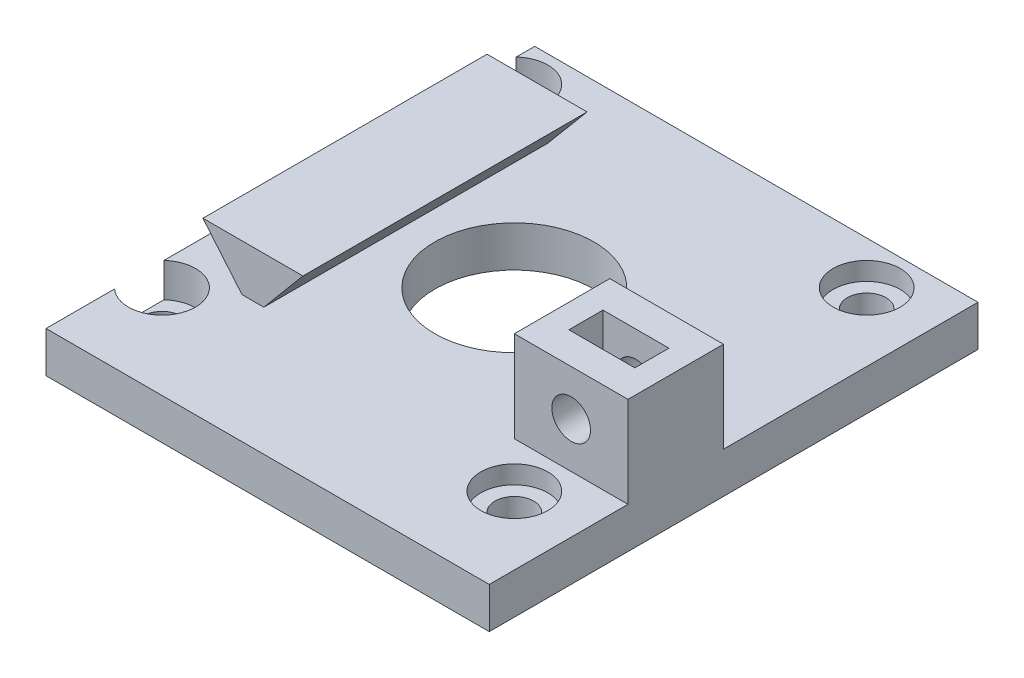
ISO-10303-21;
HEADER;
FILE_DESCRIPTION(('STEP AP214'),'2;1');
FILE_NAME('part.step','',(''),(''),'','','');
FILE_SCHEMA(('AUTOMOTIVE_DESIGN { 1 0 10303 214 1 1 1 1 }'));
ENDSEC;
DATA;
#1=APPLICATION_CONTEXT('core data for automotive mechanical design processes');
#2=APPLICATION_PROTOCOL_DEFINITION('international standard','automotive_design',2000,#1);
#3=PRODUCT_CONTEXT('',#1,'mechanical');
#4=PRODUCT('Part','Part','',(#3));
#5=PRODUCT_RELATED_PRODUCT_CATEGORY('part','',(#4));
#6=PRODUCT_DEFINITION_FORMATION('','',#4);
#7=PRODUCT_DEFINITION_CONTEXT('part definition',#1,'design');
#8=PRODUCT_DEFINITION('design','',#6,#7);
#9=PRODUCT_DEFINITION_SHAPE('','',#8);
#10=(LENGTH_UNIT() NAMED_UNIT(*) SI_UNIT(.MILLI.,.METRE.));
#11=(NAMED_UNIT(*) PLANE_ANGLE_UNIT() SI_UNIT($,.RADIAN.));
#12=(NAMED_UNIT(*) SI_UNIT($,.STERADIAN.) SOLID_ANGLE_UNIT());
#13=UNCERTAINTY_MEASURE_WITH_UNIT(LENGTH_MEASURE(1.E-05),#10,'distance_accuracy_value','');
#14=(GEOMETRIC_REPRESENTATION_CONTEXT(3) GLOBAL_UNCERTAINTY_ASSIGNED_CONTEXT((#13)) GLOBAL_UNIT_ASSIGNED_CONTEXT((#10,
#11,#12)) REPRESENTATION_CONTEXT('',''));
#15=CARTESIAN_POINT('',(0.,0.,0.));
#16=DIRECTION('',(0.,0.,1.));
#17=DIRECTION('',(1.,0.,0.));
#18=AXIS2_PLACEMENT_3D('',#15,#16,#17);
#19=CARTESIAN_POINT('',(-15.5,3.6,-15.5));
#20=DIRECTION('',(0.,-1.,0.));
#21=DIRECTION('',(0.,0.,-1.));
#22=AXIS2_PLACEMENT_3D('',#19,#20,#21);
#23=CYLINDRICAL_SURFACE('',#22,1.7);
#24=CARTESIAN_POINT('',(-15.5,0.,-15.5));
#25=DIRECTION('',(0.,1.,0.));
#26=DIRECTION('',(0.,0.,1.));
#27=AXIS2_PLACEMENT_3D('',#24,#25,#26);
#28=CIRCLE('',#27,1.7);
#29=CARTESIAN_POINT('',(-15.5,0.,-13.8));
#30=VERTEX_POINT('',#29);
#31=EDGE_CURVE('E379',#30,#30,#28,.T.);
#32=ORIENTED_EDGE('',*,*,#31,.F.);
#33=EDGE_LOOP('',(#32));
#34=FACE_BOUND('',#33,.T.);
#35=CARTESIAN_POINT('',(-15.5,0.6,-15.5));
#36=DIRECTION('',(0.,1.,0.));
#37=DIRECTION('',(0.,0.,1.));
#38=AXIS2_PLACEMENT_3D('',#35,#36,#37);
#39=CIRCLE('',#38,1.7);
#40=CARTESIAN_POINT('',(-15.5,0.6,-13.8));
#41=VERTEX_POINT('',#40);
#42=EDGE_CURVE('E210',#41,#41,#39,.T.);
#43=ORIENTED_EDGE('',*,*,#42,.T.);
#44=EDGE_LOOP('',(#43));
#45=FACE_BOUND('',#44,.T.);
#46=ADVANCED_FACE('F42',(#34,#45),#23,.F.);
#47=CARTESIAN_POINT('',(-15.5,3.6,15.5));
#48=DIRECTION('',(0.,-1.,0.));
#49=DIRECTION('',(0.,0.,-1.));
#50=AXIS2_PLACEMENT_3D('',#47,#48,#49);
#51=CYLINDRICAL_SURFACE('',#50,1.7);
#52=CARTESIAN_POINT('',(-15.5,0.,15.5));
#53=DIRECTION('',(0.,1.,0.));
#54=DIRECTION('',(0.,0.,1.));
#55=AXIS2_PLACEMENT_3D('',#52,#53,#54);
#56=CIRCLE('',#55,1.7);
#57=CARTESIAN_POINT('',(-15.5,0.,17.2));
#58=VERTEX_POINT('',#57);
#59=EDGE_CURVE('E370',#58,#58,#56,.T.);
#60=ORIENTED_EDGE('',*,*,#59,.F.);
#61=EDGE_LOOP('',(#60));
#62=FACE_BOUND('',#61,.T.);
#63=CARTESIAN_POINT('',(-15.5,0.6,15.5));
#64=DIRECTION('',(0.,1.,0.));
#65=DIRECTION('',(0.,0.,1.));
#66=AXIS2_PLACEMENT_3D('',#63,#64,#65);
#67=CIRCLE('',#66,1.7);
#68=CARTESIAN_POINT('',(-15.5,0.6,17.2));
#69=VERTEX_POINT('',#68);
#70=EDGE_CURVE('E215',#69,#69,#67,.T.);
#71=ORIENTED_EDGE('',*,*,#70,.T.);
#72=EDGE_LOOP('',(#71));
#73=FACE_BOUND('',#72,.T.);
#74=ADVANCED_FACE('F507',(#62,#73),#51,.F.);
#75=CARTESIAN_POINT('',(16.5,7.6,0.5));
#76=DIRECTION('',(0.,0.,1.));
#77=DIRECTION('',(1.,0.,0.));
#78=AXIS2_PLACEMENT_3D('',#75,#76,#77);
#79=CYLINDRICAL_SURFACE('',#78,1.7);
#80=CARTESIAN_POINT('',(16.5,7.6,3.1));
#81=DIRECTION('',(0.,0.,1.));
#82=DIRECTION('',(1.,0.,0.));
#83=AXIS2_PLACEMENT_3D('',#80,#81,#82);
#84=CIRCLE('',#83,1.7);
#85=CARTESIAN_POINT('',(18.2,7.6,3.1));
#86=VERTEX_POINT('',#85);
#87=EDGE_CURVE('E302',#86,#86,#84,.T.);
#88=ORIENTED_EDGE('',*,*,#87,.F.);
#89=EDGE_LOOP('',(#88));
#90=FACE_BOUND('',#89,.T.);
#91=CARTESIAN_POINT('',(16.5,7.6,5.8));
#92=DIRECTION('',(0.,0.,1.));
#93=DIRECTION('',(1.,0.,0.));
#94=AXIS2_PLACEMENT_3D('',#91,#92,#93);
#95=CIRCLE('',#94,1.7);
#96=CARTESIAN_POINT('',(18.2,7.6,5.8));
#97=VERTEX_POINT('',#96);
#98=EDGE_CURVE('E289',#97,#97,#95,.F.);
#99=ORIENTED_EDGE('',*,*,#98,.F.);
#100=EDGE_LOOP('',(#99));
#101=FACE_BOUND('',#100,.T.);
#102=ADVANCED_FACE('F513',(#90,#101),#79,.F.);
#103=CARTESIAN_POINT('',(15.5,3.6,-15.5));
#104=DIRECTION('',(0.,-1.,0.));
#105=DIRECTION('',(0.,0.,-1.));
#106=AXIS2_PLACEMENT_3D('',#103,#104,#105);
#107=CYLINDRICAL_SURFACE('',#106,1.7);
#108=CARTESIAN_POINT('',(15.5,0.,-15.5));
#109=DIRECTION('',(0.,1.,0.));
#110=DIRECTION('',(0.,0.,1.));
#111=AXIS2_PLACEMENT_3D('',#108,#109,#110);
#112=CIRCLE('',#111,1.7);
#113=CARTESIAN_POINT('',(15.5,0.,-13.8));
#114=VERTEX_POINT('',#113);
#115=EDGE_CURVE('E375',#114,#114,#112,.T.);
#116=ORIENTED_EDGE('',*,*,#115,.F.);
#117=EDGE_LOOP('',(#116));
#118=FACE_BOUND('',#117,.T.);
#119=CARTESIAN_POINT('',(15.5,2.,-15.5));
#120=DIRECTION('',(0.,1.,0.));
#121=DIRECTION('',(0.,0.,1.));
#122=AXIS2_PLACEMENT_3D('',#119,#120,#121);
#123=CIRCLE('',#122,1.7);
#124=CARTESIAN_POINT('',(15.5,2.,-13.8));
#125=VERTEX_POINT('',#124);
#126=EDGE_CURVE('E371',#125,#125,#123,.T.);
#127=ORIENTED_EDGE('',*,*,#126,.T.);
#128=EDGE_LOOP('',(#127));
#129=FACE_BOUND('',#128,.T.);
#130=ADVANCED_FACE('F520',(#118,#129),#107,.F.);
#131=CARTESIAN_POINT('',(15.5,3.6,15.5));
#132=DIRECTION('',(0.,-1.,0.));
#133=DIRECTION('',(0.,0.,-1.));
#134=AXIS2_PLACEMENT_3D('',#131,#132,#133);
#135=CYLINDRICAL_SURFACE('',#134,1.7);
#136=CARTESIAN_POINT('',(15.5,0.,15.5));
#137=DIRECTION('',(0.,1.,0.));
#138=DIRECTION('',(0.,0.,1.));
#139=AXIS2_PLACEMENT_3D('',#136,#137,#138);
#140=CIRCLE('',#139,1.7);
#141=CARTESIAN_POINT('',(15.5,0.,17.2));
#142=VERTEX_POINT('',#141);
#143=EDGE_CURVE('E366',#142,#142,#140,.T.);
#144=ORIENTED_EDGE('',*,*,#143,.F.);
#145=EDGE_LOOP('',(#144));
#146=FACE_BOUND('',#145,.T.);
#147=CARTESIAN_POINT('',(15.5,2.,15.5));
#148=DIRECTION('',(0.,1.,0.));
#149=DIRECTION('',(0.,0.,1.));
#150=AXIS2_PLACEMENT_3D('',#147,#148,#149);
#151=CIRCLE('',#150,1.7);
#152=CARTESIAN_POINT('',(15.5,2.,17.2));
#153=VERTEX_POINT('',#152);
#154=EDGE_CURVE('E365',#153,#153,#151,.T.);
#155=ORIENTED_EDGE('',*,*,#154,.T.);
#156=EDGE_LOOP('',(#155));
#157=FACE_BOUND('',#156,.T.);
#158=ADVANCED_FACE('F530',(#146,#157),#135,.F.);
#159=CARTESIAN_POINT('',(0.,3.6,0.));
#160=DIRECTION('',(0.,1.,0.));
#161=DIRECTION('',(0.,0.,1.));
#162=AXIS2_PLACEMENT_3D('',#159,#160,#161);
#163=PLANE('',#162);
#164=DIRECTION('',(-1.,0.,0.));
#165=VECTOR('',#164,1.);
#166=CARTESIAN_POINT('',(0.,3.6,-12.5));
#167=LINE('',#166,#165);
#168=CARTESIAN_POINT('',(-9.54030848782689,3.6,-12.5));
#169=VERTEX_POINT('',#168);
#170=CARTESIAN_POINT('',(-11.4596915121731,3.6,-12.5));
#171=VERTEX_POINT('',#170);
#172=EDGE_CURVE('E11',#169,#171,#167,.T.);
#173=ORIENTED_EDGE('',*,*,#172,.F.);
#174=DIRECTION('',(0.,0.,-1.));
#175=VECTOR('',#174,1.);
#176=CARTESIAN_POINT('',(-9.54030848782689,3.6,0.));
#177=LINE('',#176,#175);
#178=CARTESIAN_POINT('',(-9.54030848782689,3.6,12.5));
#179=VERTEX_POINT('',#178);
#180=EDGE_CURVE('E51',#179,#169,#177,.T.);
#181=ORIENTED_EDGE('',*,*,#180,.F.);
#182=DIRECTION('',(-1.,0.,0.));
#183=VECTOR('',#182,1.);
#184=CARTESIAN_POINT('',(0.,3.6,12.5));
#185=LINE('',#184,#183);
#186=CARTESIAN_POINT('',(-11.4596915121731,3.6,12.5));
#187=VERTEX_POINT('',#186);
#188=EDGE_CURVE('E467',#179,#187,#185,.T.);
#189=ORIENTED_EDGE('',*,*,#188,.T.);
#190=DIRECTION('',(0.,0.,1.));
#191=VECTOR('',#190,1.);
#192=CARTESIAN_POINT('',(-11.4596915121731,3.6,0.));
#193=LINE('',#192,#191);
#194=EDGE_CURVE('E471',#171,#187,#193,.T.);
#195=ORIENTED_EDGE('',*,*,#194,.F.);
#196=EDGE_LOOP('',(#173,#181,#189,#195));
#197=FACE_BOUND('',#196,.T.);
#198=DIRECTION('',(-1.,0.,0.));
#199=VECTOR('',#198,1.);
#200=CARTESIAN_POINT('',(21.5,3.6,3.1));
#201=LINE('',#200,#199);
#202=CARTESIAN_POINT('',(21.5,3.6,3.1));
#203=VERTEX_POINT('',#202);
#204=CARTESIAN_POINT('',(11.5,3.6,3.1));
#205=VERTEX_POINT('',#204);
#206=EDGE_CURVE('E308',#203,#205,#201,.T.);
#207=ORIENTED_EDGE('',*,*,#206,.F.);
#208=DIRECTION('',(0.,0.,-1.));
#209=VECTOR('',#208,1.);
#210=CARTESIAN_POINT('',(21.5,3.6,23.7051282051282));
#211=LINE('',#210,#209);
#212=CARTESIAN_POINT('',(21.5,3.6,-19.2948717948718));
#213=VERTEX_POINT('',#212);
#214=EDGE_CURVE('E401',#203,#213,#211,.T.);
#215=ORIENTED_EDGE('',*,*,#214,.T.);
#216=DIRECTION('',(-1.,0.,0.));
#217=VECTOR('',#216,1.);
#218=CARTESIAN_POINT('',(21.5,3.6,-19.2948717948718));
#219=LINE('',#218,#217);
#220=CARTESIAN_POINT('',(-17.5,3.6,-19.2948717948718));
#221=VERTEX_POINT('',#220);
#222=EDGE_CURVE('E405',#213,#221,#219,.T.);
#223=ORIENTED_EDGE('',*,*,#222,.T.);
#224=DIRECTION('',(0.,0.,1.));
#225=VECTOR('',#224,1.);
#226=CARTESIAN_POINT('',(-17.5,3.6,23.7051282051282));
#227=LINE('',#226,#225);
#228=CARTESIAN_POINT('',(-17.5,3.6,-17.6685248442201));
#229=VERTEX_POINT('',#228);
#230=EDGE_CURVE('E392',#221,#229,#227,.T.);
#231=ORIENTED_EDGE('',*,*,#230,.T.);
#232=CARTESIAN_POINT('',(-15.5,3.6,-15.5));
#233=DIRECTION('',(0.,1.,0.));
#234=DIRECTION('',(0.,0.,1.));
#235=AXIS2_PLACEMENT_3D('',#232,#233,#234);
#236=CIRCLE('',#235,2.95);
#237=CARTESIAN_POINT('',(-17.5,3.6,-13.3314751557799));
#238=VERTEX_POINT('',#237);
#239=EDGE_CURVE('E356',#238,#229,#236,.T.);
#240=ORIENTED_EDGE('',*,*,#239,.F.);
#241=CARTESIAN_POINT('',(-17.5,3.6,13.3314751557799));
#242=VERTEX_POINT('',#241);
#243=EDGE_CURVE('E397',#238,#242,#227,.T.);
#244=ORIENTED_EDGE('',*,*,#243,.T.);
#245=CARTESIAN_POINT('',(-15.5,3.6,15.5));
#246=DIRECTION('',(0.,1.,0.));
#247=DIRECTION('',(0.,0.,1.));
#248=AXIS2_PLACEMENT_3D('',#245,#246,#247);
#249=CIRCLE('',#248,2.95);
#250=CARTESIAN_POINT('',(-17.5,3.6,17.6685248442202));
#251=VERTEX_POINT('',#250);
#252=EDGE_CURVE('E193',#251,#242,#249,.T.);
#253=ORIENTED_EDGE('',*,*,#252,.F.);
#254=CARTESIAN_POINT('',(-17.5,3.6,23.7051282051282));
#255=VERTEX_POINT('',#254);
#256=EDGE_CURVE('E398',#251,#255,#227,.T.);
#257=ORIENTED_EDGE('',*,*,#256,.T.);
#258=DIRECTION('',(1.,0.,0.));
#259=VECTOR('',#258,1.);
#260=CARTESIAN_POINT('',(21.5,3.6,23.7051282051282));
#261=LINE('',#260,#259);
#262=CARTESIAN_POINT('',(21.5,3.6,23.7051282051282));
#263=VERTEX_POINT('',#262);
#264=EDGE_CURVE('E396',#255,#263,#261,.T.);
#265=ORIENTED_EDGE('',*,*,#264,.T.);
#266=CARTESIAN_POINT('',(21.5,3.6,11.5));
#267=VERTEX_POINT('',#266);
#268=EDGE_CURVE('E402',#263,#267,#211,.T.);
#269=ORIENTED_EDGE('',*,*,#268,.T.);
#270=DIRECTION('',(1.,0.,0.));
#271=VECTOR('',#270,1.);
#272=CARTESIAN_POINT('',(21.5,3.6,11.5));
#273=LINE('',#272,#271);
#274=CARTESIAN_POINT('',(11.5,3.6,11.5));
#275=VERTEX_POINT('',#274);
#276=EDGE_CURVE('E322',#275,#267,#273,.T.);
#277=ORIENTED_EDGE('',*,*,#276,.F.);
#278=DIRECTION('',(0.,0.,1.));
#279=VECTOR('',#278,1.);
#280=CARTESIAN_POINT('',(11.5,3.6,11.5));
#281=LINE('',#280,#279);
#282=EDGE_CURVE('E318',#205,#275,#281,.T.);
#283=ORIENTED_EDGE('',*,*,#282,.F.);
#284=EDGE_LOOP('',(#207,#215,#223,#231,#240,#244,#253,#257,#265,#269,#277,#283));
#285=FACE_BOUND('',#284,.T.);
#286=CARTESIAN_POINT('',(15.5,3.6,-15.5));
#287=DIRECTION('',(0.,1.,0.));
#288=DIRECTION('',(0.,0.,1.));
#289=AXIS2_PLACEMENT_3D('',#286,#287,#288);
#290=CIRCLE('',#289,2.95);
#291=CARTESIAN_POINT('',(15.5,3.6,-12.55));
#292=VERTEX_POINT('',#291);
#293=EDGE_CURVE('E357',#292,#292,#290,.T.);
#294=ORIENTED_EDGE('',*,*,#293,.F.);
#295=EDGE_LOOP('',(#294));
#296=FACE_BOUND('',#295,.T.);
#297=CARTESIAN_POINT('',(15.5,3.6,15.5));
#298=DIRECTION('',(0.,1.,0.));
#299=DIRECTION('',(0.,0.,1.));
#300=AXIS2_PLACEMENT_3D('',#297,#298,#299);
#301=CIRCLE('',#300,2.95);
#302=CARTESIAN_POINT('',(15.5,3.6,18.45));
#303=VERTEX_POINT('',#302);
#304=EDGE_CURVE('E344',#303,#303,#301,.T.);
#305=ORIENTED_EDGE('',*,*,#304,.F.);
#306=EDGE_LOOP('',(#305));
#307=FACE_BOUND('',#306,.T.);
#308=CARTESIAN_POINT('',(0.,3.6,0.));
#309=DIRECTION('',(0.,1.,0.));
#310=DIRECTION('',(0.,0.,1.));
#311=AXIS2_PLACEMENT_3D('',#308,#309,#310);
#312=CIRCLE('',#311,7.);
#313=CARTESIAN_POINT('',(0.,3.6,7.));
#314=VERTEX_POINT('',#313);
#315=EDGE_CURVE('E384',#314,#314,#312,.T.);
#316=ORIENTED_EDGE('',*,*,#315,.F.);
#317=EDGE_LOOP('',(#316));
#318=FACE_BOUND('',#317,.T.);
#319=ADVANCED_FACE('F488',(#197,#285,#296,#307,#318),#163,.T.);
#320=CARTESIAN_POINT('',(0.,0.,0.));
#321=DIRECTION('',(0.,1.,0.));
#322=DIRECTION('',(0.,0.,1.));
#323=AXIS2_PLACEMENT_3D('',#320,#321,#322);
#324=PLANE('',#323);
#325=DIRECTION('',(0.,0.,1.));
#326=VECTOR('',#325,1.);
#327=CARTESIAN_POINT('',(-17.5,0.,23.7051282051282));
#328=LINE('',#327,#326);
#329=CARTESIAN_POINT('',(-17.5,0.,-19.2948717948718));
#330=VERTEX_POINT('',#329);
#331=CARTESIAN_POINT('',(-17.5,0.,23.7051282051282));
#332=VERTEX_POINT('',#331);
#333=EDGE_CURVE('E388',#330,#332,#328,.T.);
#334=ORIENTED_EDGE('',*,*,#333,.F.);
#335=DIRECTION('',(-1.,0.,0.));
#336=VECTOR('',#335,1.);
#337=CARTESIAN_POINT('',(21.5,0.,-19.2948717948718));
#338=LINE('',#337,#336);
#339=CARTESIAN_POINT('',(21.5,0.,-19.2948717948718));
#340=VERTEX_POINT('',#339);
#341=EDGE_CURVE('E418',#340,#330,#338,.T.);
#342=ORIENTED_EDGE('',*,*,#341,.F.);
#343=DIRECTION('',(0.,0.,-1.));
#344=VECTOR('',#343,1.);
#345=CARTESIAN_POINT('',(21.5,0.,23.7051282051282));
#346=LINE('',#345,#344);
#347=CARTESIAN_POINT('',(21.5,0.,23.7051282051282));
#348=VERTEX_POINT('',#347);
#349=EDGE_CURVE('E415',#348,#340,#346,.T.);
#350=ORIENTED_EDGE('',*,*,#349,.F.);
#351=DIRECTION('',(1.,0.,0.));
#352=VECTOR('',#351,1.);
#353=CARTESIAN_POINT('',(21.5,0.,23.7051282051282));
#354=LINE('',#353,#352);
#355=EDGE_CURVE('E412',#332,#348,#354,.T.);
#356=ORIENTED_EDGE('',*,*,#355,.F.);
#357=EDGE_LOOP('',(#334,#342,#350,#356));
#358=FACE_BOUND('',#357,.T.);
#359=CARTESIAN_POINT('',(0.,0.,0.));
#360=DIRECTION('',(0.,1.,0.));
#361=DIRECTION('',(0.,0.,1.));
#362=AXIS2_PLACEMENT_3D('',#359,#360,#361);
#363=CIRCLE('',#362,7.);
#364=CARTESIAN_POINT('',(0.,0.,7.));
#365=VERTEX_POINT('',#364);
#366=EDGE_CURVE('E383',#365,#365,#363,.T.);
#367=ORIENTED_EDGE('',*,*,#366,.T.);
#368=EDGE_LOOP('',(#367));
#369=FACE_BOUND('',#368,.T.);
#370=ORIENTED_EDGE('',*,*,#31,.T.);
#371=EDGE_LOOP('',(#370));
#372=FACE_BOUND('',#371,.T.);
#373=ORIENTED_EDGE('',*,*,#115,.T.);
#374=EDGE_LOOP('',(#373));
#375=FACE_BOUND('',#374,.T.);
#376=ORIENTED_EDGE('',*,*,#59,.T.);
#377=EDGE_LOOP('',(#376));
#378=FACE_BOUND('',#377,.T.);
#379=ORIENTED_EDGE('',*,*,#143,.T.);
#380=EDGE_LOOP('',(#379));
#381=FACE_BOUND('',#380,.T.);
#382=ADVANCED_FACE('F529',(#358,#369,#372,#375,#378,#381),#324,.F.);
#383=CARTESIAN_POINT('',(-17.5,3.6,23.7051282051282));
#384=DIRECTION('',(1.,0.,0.));
#385=DIRECTION('',(0.,0.,-1.));
#386=AXIS2_PLACEMENT_3D('',#383,#384,#385);
#387=PLANE('',#386);
#388=DIRECTION('',(0.,0.,1.));
#389=VECTOR('',#388,1.);
#390=CARTESIAN_POINT('',(-17.5,0.6,13.3314751557799));
#391=LINE('',#390,#389);
#392=CARTESIAN_POINT('',(-17.5,0.6,13.3314751557799));
#393=VERTEX_POINT('',#392);
#394=CARTESIAN_POINT('',(-17.5,0.6,17.6685248442202));
#395=VERTEX_POINT('',#394);
#396=EDGE_CURVE('E204',#393,#395,#391,.T.);
#397=ORIENTED_EDGE('',*,*,#396,.F.);
#398=DIRECTION('',(0.,1.,0.));
#399=VECTOR('',#398,1.);
#400=CARTESIAN_POINT('',(-17.5,2.,13.3314751557799));
#401=LINE('',#400,#399);
#402=EDGE_CURVE('E187',#393,#242,#401,.T.);
#403=ORIENTED_EDGE('',*,*,#402,.T.);
#404=ORIENTED_EDGE('',*,*,#243,.F.);
#405=DIRECTION('',(0.,1.,0.));
#406=VECTOR('',#405,1.);
#407=CARTESIAN_POINT('',(-17.5,2.,-13.3314751557799));
#408=LINE('',#407,#406);
#409=CARTESIAN_POINT('',(-17.5,0.6,-13.3314751557799));
#410=VERTEX_POINT('',#409);
#411=EDGE_CURVE('E436',#238,#410,#408,.F.);
#412=ORIENTED_EDGE('',*,*,#411,.T.);
#413=DIRECTION('',(0.,0.,1.));
#414=VECTOR('',#413,1.);
#415=CARTESIAN_POINT('',(-17.5,0.6,-17.6685248442201));
#416=LINE('',#415,#414);
#417=CARTESIAN_POINT('',(-17.5,0.6,-17.6685248442201));
#418=VERTEX_POINT('',#417);
#419=EDGE_CURVE('E206',#418,#410,#416,.T.);
#420=ORIENTED_EDGE('',*,*,#419,.F.);
#421=DIRECTION('',(0.,1.,0.));
#422=VECTOR('',#421,1.);
#423=CARTESIAN_POINT('',(-17.5,2.,-17.6685248442201));
#424=LINE('',#423,#422);
#425=EDGE_CURVE('E445',#418,#229,#424,.T.);
#426=ORIENTED_EDGE('',*,*,#425,.T.);
#427=ORIENTED_EDGE('',*,*,#230,.F.);
#428=DIRECTION('',(0.,-1.,0.));
#429=VECTOR('',#428,1.);
#430=CARTESIAN_POINT('',(-17.5,3.6,-19.2948717948718));
#431=LINE('',#430,#429);
#432=EDGE_CURVE('E408',#221,#330,#431,.T.);
#433=ORIENTED_EDGE('',*,*,#432,.T.);
#434=ORIENTED_EDGE('',*,*,#333,.T.);
#435=DIRECTION('',(0.,-1.,0.));
#436=VECTOR('',#435,1.);
#437=CARTESIAN_POINT('',(-17.5,3.6,23.7051282051282));
#438=LINE('',#437,#436);
#439=EDGE_CURVE('E432',#255,#332,#438,.T.);
#440=ORIENTED_EDGE('',*,*,#439,.F.);
#441=ORIENTED_EDGE('',*,*,#256,.F.);
#442=DIRECTION('',(0.,1.,0.));
#443=VECTOR('',#442,1.);
#444=CARTESIAN_POINT('',(-17.5,2.,17.6685248442202));
#445=LINE('',#444,#443);
#446=EDGE_CURVE('E200',#251,#395,#445,.F.);
#447=ORIENTED_EDGE('',*,*,#446,.T.);
#448=EDGE_LOOP('',(#397,#403,#404,#412,#420,#426,#427,#433,#434,#440,#441,#447));
#449=FACE_BOUND('',#448,.T.);
#450=ADVANCED_FACE('F44',(#449),#387,.F.);
#451=CARTESIAN_POINT('',(21.5,3.6,23.7051282051282));
#452=DIRECTION('',(0.,0.,-1.));
#453=DIRECTION('',(-1.,0.,0.));
#454=AXIS2_PLACEMENT_3D('',#451,#452,#453);
#455=PLANE('',#454);
#456=ORIENTED_EDGE('',*,*,#355,.T.);
#457=DIRECTION('',(0.,-1.,0.));
#458=VECTOR('',#457,1.);
#459=CARTESIAN_POINT('',(21.5,3.6,23.7051282051282));
#460=LINE('',#459,#458);
#461=EDGE_CURVE('E428',#263,#348,#460,.T.);
#462=ORIENTED_EDGE('',*,*,#461,.F.);
#463=ORIENTED_EDGE('',*,*,#264,.F.);
#464=ORIENTED_EDGE('',*,*,#439,.T.);
#465=EDGE_LOOP('',(#456,#462,#463,#464));
#466=FACE_BOUND('',#465,.T.);
#467=ADVANCED_FACE('F539',(#466),#455,.F.);
#468=CARTESIAN_POINT('',(21.5,3.6,23.7051282051282));
#469=DIRECTION('',(-1.,0.,0.));
#470=DIRECTION('',(0.,0.,1.));
#471=AXIS2_PLACEMENT_3D('',#468,#469,#470);
#472=PLANE('',#471);
#473=ORIENTED_EDGE('',*,*,#349,.T.);
#474=DIRECTION('',(0.,-1.,0.));
#475=VECTOR('',#474,1.);
#476=CARTESIAN_POINT('',(21.5,3.6,-19.2948717948718));
#477=LINE('',#476,#475);
#478=EDGE_CURVE('E424',#213,#340,#477,.T.);
#479=ORIENTED_EDGE('',*,*,#478,.F.);
#480=ORIENTED_EDGE('',*,*,#214,.F.);
#481=DIRECTION('',(0.,-1.,0.));
#482=VECTOR('',#481,1.);
#483=CARTESIAN_POINT('',(21.5,11.6,3.1));
#484=LINE('',#483,#482);
#485=CARTESIAN_POINT('',(21.5,11.6,3.1));
#486=VERTEX_POINT('',#485);
#487=EDGE_CURVE('E332',#486,#203,#484,.T.);
#488=ORIENTED_EDGE('',*,*,#487,.F.);
#489=DIRECTION('',(0.,0.,-1.));
#490=VECTOR('',#489,1.);
#491=CARTESIAN_POINT('',(21.5,11.6,11.5));
#492=LINE('',#491,#490);
#493=CARTESIAN_POINT('',(21.5,11.6,11.5));
#494=VERTEX_POINT('',#493);
#495=EDGE_CURVE('E311',#494,#486,#492,.T.);
#496=ORIENTED_EDGE('',*,*,#495,.F.);
#497=DIRECTION('',(0.,-1.,0.));
#498=VECTOR('',#497,1.);
#499=CARTESIAN_POINT('',(21.5,11.6,11.5));
#500=LINE('',#499,#498);
#501=EDGE_CURVE('E336',#494,#267,#500,.T.);
#502=ORIENTED_EDGE('',*,*,#501,.T.);
#503=ORIENTED_EDGE('',*,*,#268,.F.);
#504=ORIENTED_EDGE('',*,*,#461,.T.);
#505=EDGE_LOOP('',(#473,#479,#480,#488,#496,#502,#503,#504));
#506=FACE_BOUND('',#505,.T.);
#507=ADVANCED_FACE('F536',(#506),#472,.F.);
#508=CARTESIAN_POINT('',(21.5,3.6,-19.2948717948718));
#509=DIRECTION('',(0.,0.,1.));
#510=DIRECTION('',(1.,0.,0.));
#511=AXIS2_PLACEMENT_3D('',#508,#509,#510);
#512=PLANE('',#511);
#513=ORIENTED_EDGE('',*,*,#341,.T.);
#514=ORIENTED_EDGE('',*,*,#432,.F.);
#515=ORIENTED_EDGE('',*,*,#222,.F.);
#516=ORIENTED_EDGE('',*,*,#478,.T.);
#517=EDGE_LOOP('',(#513,#514,#515,#516));
#518=FACE_BOUND('',#517,.T.);
#519=ADVANCED_FACE('F525',(#518),#512,.F.);
#520=CARTESIAN_POINT('',(0.,3.6,0.));
#521=DIRECTION('',(0.,-1.,0.));
#522=DIRECTION('',(0.,0.,-1.));
#523=AXIS2_PLACEMENT_3D('',#520,#521,#522);
#524=CYLINDRICAL_SURFACE('',#523,7.);
#525=ORIENTED_EDGE('',*,*,#315,.T.);
#526=EDGE_LOOP('',(#525));
#527=FACE_BOUND('',#526,.T.);
#528=ORIENTED_EDGE('',*,*,#366,.F.);
#529=EDGE_LOOP('',(#528));
#530=FACE_BOUND('',#529,.T.);
#531=ADVANCED_FACE('F521',(#527,#530),#524,.F.);
#532=CARTESIAN_POINT('',(15.5,2.,15.5));
#533=DIRECTION('',(0.,1.,0.));
#534=DIRECTION('',(0.,0.,1.));
#535=AXIS2_PLACEMENT_3D('',#532,#533,#534);
#536=CYLINDRICAL_SURFACE('',#535,2.95);
#537=CARTESIAN_POINT('',(15.5,2.,15.5));
#538=DIRECTION('',(0.,1.,0.));
#539=DIRECTION('',(0.,0.,1.));
#540=AXIS2_PLACEMENT_3D('',#537,#538,#539);
#541=CIRCLE('',#540,2.95);
#542=CARTESIAN_POINT('',(15.5,2.,18.45));
#543=VERTEX_POINT('',#542);
#544=EDGE_CURVE('E345',#543,#543,#541,.T.);
#545=ORIENTED_EDGE('',*,*,#544,.F.);
#546=EDGE_LOOP('',(#545));
#547=FACE_BOUND('',#546,.T.);
#548=ORIENTED_EDGE('',*,*,#304,.T.);
#549=EDGE_LOOP('',(#548));
#550=FACE_BOUND('',#549,.T.);
#551=ADVANCED_FACE('F524',(#547,#550),#536,.F.);
#552=CARTESIAN_POINT('',(15.5,2.,15.5));
#553=DIRECTION('',(0.,1.,0.));
#554=DIRECTION('',(0.,0.,1.));
#555=AXIS2_PLACEMENT_3D('',#552,#553,#554);
#556=PLANE('',#555);
#557=ORIENTED_EDGE('',*,*,#154,.F.);
#558=EDGE_LOOP('',(#557));
#559=FACE_BOUND('',#558,.T.);
#560=ORIENTED_EDGE('',*,*,#544,.T.);
#561=EDGE_LOOP('',(#560));
#562=FACE_BOUND('',#561,.T.);
#563=ADVANCED_FACE('F659',(#559,#562),#556,.T.);
#564=CARTESIAN_POINT('',(-15.5,2.,15.5));
#565=DIRECTION('',(0.,1.,0.));
#566=DIRECTION('',(0.,0.,1.));
#567=AXIS2_PLACEMENT_3D('',#564,#565,#566);
#568=CYLINDRICAL_SURFACE('',#567,2.95);
#569=ORIENTED_EDGE('',*,*,#402,.F.);
#570=CARTESIAN_POINT('',(-15.5,0.6,15.5));
#571=DIRECTION('',(0.,1.,0.));
#572=DIRECTION('',(0.,0.,1.));
#573=AXIS2_PLACEMENT_3D('',#570,#571,#572);
#574=CIRCLE('',#573,2.95);
#575=EDGE_CURVE('E190',#395,#393,#574,.T.);
#576=ORIENTED_EDGE('',*,*,#575,.F.);
#577=ORIENTED_EDGE('',*,*,#446,.F.);
#578=ORIENTED_EDGE('',*,*,#252,.T.);
#579=EDGE_LOOP('',(#569,#576,#577,#578));
#580=FACE_BOUND('',#579,.T.);
#581=ADVANCED_FACE('F189',(#580),#568,.F.);
#582=CARTESIAN_POINT('',(15.5,2.,-15.5));
#583=DIRECTION('',(0.,1.,0.));
#584=DIRECTION('',(0.,0.,1.));
#585=AXIS2_PLACEMENT_3D('',#582,#583,#584);
#586=CYLINDRICAL_SURFACE('',#585,2.95);
#587=CARTESIAN_POINT('',(15.5,2.,-15.5));
#588=DIRECTION('',(0.,1.,0.));
#589=DIRECTION('',(0.,0.,1.));
#590=AXIS2_PLACEMENT_3D('',#587,#588,#589);
#591=CIRCLE('',#590,2.95);
#592=CARTESIAN_POINT('',(15.5,2.,-12.55));
#593=VERTEX_POINT('',#592);
#594=EDGE_CURVE('E352',#593,#593,#591,.T.);
#595=ORIENTED_EDGE('',*,*,#594,.F.);
#596=EDGE_LOOP('',(#595));
#597=FACE_BOUND('',#596,.T.);
#598=ORIENTED_EDGE('',*,*,#293,.T.);
#599=EDGE_LOOP('',(#598));
#600=FACE_BOUND('',#599,.T.);
#601=ADVANCED_FACE('F643',(#597,#600),#586,.F.);
#602=CARTESIAN_POINT('',(15.5,2.,-15.5));
#603=DIRECTION('',(0.,1.,0.));
#604=DIRECTION('',(0.,0.,1.));
#605=AXIS2_PLACEMENT_3D('',#602,#603,#604);
#606=PLANE('',#605);
#607=ORIENTED_EDGE('',*,*,#126,.F.);
#608=EDGE_LOOP('',(#607));
#609=FACE_BOUND('',#608,.T.);
#610=ORIENTED_EDGE('',*,*,#594,.T.);
#611=EDGE_LOOP('',(#610));
#612=FACE_BOUND('',#611,.T.);
#613=ADVANCED_FACE('F634',(#609,#612),#606,.T.);
#614=CARTESIAN_POINT('',(-15.5,2.,-15.5));
#615=DIRECTION('',(0.,1.,0.));
#616=DIRECTION('',(0.,0.,1.));
#617=AXIS2_PLACEMENT_3D('',#614,#615,#616);
#618=CYLINDRICAL_SURFACE('',#617,2.95);
#619=ORIENTED_EDGE('',*,*,#425,.F.);
#620=CARTESIAN_POINT('',(-15.5,0.6,-15.5));
#621=DIRECTION('',(0.,1.,0.));
#622=DIRECTION('',(0.,0.,1.));
#623=AXIS2_PLACEMENT_3D('',#620,#621,#622);
#624=CIRCLE('',#623,2.95);
#625=EDGE_CURVE('E218',#410,#418,#624,.T.);
#626=ORIENTED_EDGE('',*,*,#625,.F.);
#627=ORIENTED_EDGE('',*,*,#411,.F.);
#628=ORIENTED_EDGE('',*,*,#239,.T.);
#629=EDGE_LOOP('',(#619,#626,#627,#628));
#630=FACE_BOUND('',#629,.T.);
#631=ADVANCED_FACE('F630',(#630),#618,.F.);
#632=CARTESIAN_POINT('',(11.5,11.6,11.5));
#633=DIRECTION('',(1.,0.,0.));
#634=DIRECTION('',(0.,0.,-1.));
#635=AXIS2_PLACEMENT_3D('',#632,#633,#634);
#636=PLANE('',#635);
#637=ORIENTED_EDGE('',*,*,#282,.T.);
#638=DIRECTION('',(0.,-1.,0.));
#639=VECTOR('',#638,1.);
#640=CARTESIAN_POINT('',(11.5,11.6,11.5));
#641=LINE('',#640,#639);
#642=CARTESIAN_POINT('',(11.5,11.6,11.5));
#643=VERTEX_POINT('',#642);
#644=EDGE_CURVE('E340',#643,#275,#641,.T.);
#645=ORIENTED_EDGE('',*,*,#644,.F.);
#646=DIRECTION('',(0.,0.,1.));
#647=VECTOR('',#646,1.);
#648=CARTESIAN_POINT('',(11.5,11.6,11.5));
#649=LINE('',#648,#647);
#650=CARTESIAN_POINT('',(11.5,11.6,3.1));
#651=VERTEX_POINT('',#650);
#652=EDGE_CURVE('E303',#651,#643,#649,.T.);
#653=ORIENTED_EDGE('',*,*,#652,.F.);
#654=DIRECTION('',(0.,-1.,0.));
#655=VECTOR('',#654,1.);
#656=CARTESIAN_POINT('',(11.5,11.6,3.1));
#657=LINE('',#656,#655);
#658=EDGE_CURVE('E317',#651,#205,#657,.T.);
#659=ORIENTED_EDGE('',*,*,#658,.T.);
#660=EDGE_LOOP('',(#637,#645,#653,#659));
#661=FACE_BOUND('',#660,.T.);
#662=ADVANCED_FACE('F633',(#661),#636,.F.);
#663=CARTESIAN_POINT('',(21.5,11.6,11.5));
#664=DIRECTION('',(0.,0.,-1.));
#665=DIRECTION('',(-1.,0.,0.));
#666=AXIS2_PLACEMENT_3D('',#663,#664,#665);
#667=PLANE('',#666);
#668=CARTESIAN_POINT('',(16.5,7.6,11.5));
#669=DIRECTION('',(0.,0.,1.));
#670=DIRECTION('',(1.,0.,0.));
#671=AXIS2_PLACEMENT_3D('',#668,#669,#670);
#672=CIRCLE('',#671,1.7);
#673=CARTESIAN_POINT('',(18.2,7.6,11.5));
#674=VERTEX_POINT('',#673);
#675=EDGE_CURVE('E298',#674,#674,#672,.T.);
#676=ORIENTED_EDGE('',*,*,#675,.F.);
#677=EDGE_LOOP('',(#676));
#678=FACE_BOUND('',#677,.T.);
#679=ORIENTED_EDGE('',*,*,#276,.T.);
#680=ORIENTED_EDGE('',*,*,#501,.F.);
#681=DIRECTION('',(1.,0.,0.));
#682=VECTOR('',#681,1.);
#683=CARTESIAN_POINT('',(21.5,11.6,11.5));
#684=LINE('',#683,#682);
#685=EDGE_CURVE('E307',#643,#494,#684,.T.);
#686=ORIENTED_EDGE('',*,*,#685,.F.);
#687=ORIENTED_EDGE('',*,*,#644,.T.);
#688=EDGE_LOOP('',(#679,#680,#686,#687));
#689=FACE_BOUND('',#688,.T.);
#690=ADVANCED_FACE('F640',(#678,#689),#667,.F.);
#691=CARTESIAN_POINT('',(21.5,11.6,3.1));
#692=DIRECTION('',(0.,0.,1.));
#693=DIRECTION('',(1.,0.,0.));
#694=AXIS2_PLACEMENT_3D('',#691,#692,#693);
#695=PLANE('',#694);
#696=ORIENTED_EDGE('',*,*,#87,.T.);
#697=EDGE_LOOP('',(#696));
#698=FACE_BOUND('',#697,.T.);
#699=ORIENTED_EDGE('',*,*,#206,.T.);
#700=ORIENTED_EDGE('',*,*,#658,.F.);
#701=DIRECTION('',(-1.,0.,0.));
#702=VECTOR('',#701,1.);
#703=CARTESIAN_POINT('',(21.5,11.6,3.1));
#704=LINE('',#703,#702);
#705=EDGE_CURVE('E314',#486,#651,#704,.T.);
#706=ORIENTED_EDGE('',*,*,#705,.F.);
#707=ORIENTED_EDGE('',*,*,#487,.T.);
#708=EDGE_LOOP('',(#699,#700,#706,#707));
#709=FACE_BOUND('',#708,.T.);
#710=ADVANCED_FACE('F807',(#698,#709),#695,.F.);
#711=CARTESIAN_POINT('',(0.,11.6,0.));
#712=DIRECTION('',(0.,1.,0.));
#713=DIRECTION('',(0.,0.,1.));
#714=AXIS2_PLACEMENT_3D('',#711,#712,#713);
#715=PLANE('',#714);
#716=DIRECTION('',(1.,0.,0.));
#717=VECTOR('',#716,1.);
#718=CARTESIAN_POINT('',(0.,11.6,8.8));
#719=LINE('',#718,#717);
#720=CARTESIAN_POINT('',(13.5988148973221,11.6,8.8));
#721=VERTEX_POINT('',#720);
#722=CARTESIAN_POINT('',(19.4011851026779,11.6,8.8));
#723=VERTEX_POINT('',#722);
#724=EDGE_CURVE('E295',#721,#723,#719,.T.);
#725=ORIENTED_EDGE('',*,*,#724,.F.);
#726=DIRECTION('',(0.,0.,-1.));
#727=VECTOR('',#726,1.);
#728=CARTESIAN_POINT('',(13.5988148973221,11.6,0.));
#729=LINE('',#728,#727);
#730=CARTESIAN_POINT('',(13.5988148973221,11.6,5.8));
#731=VERTEX_POINT('',#730);
#732=EDGE_CURVE('E199',#721,#731,#729,.T.);
#733=ORIENTED_EDGE('',*,*,#732,.T.);
#734=DIRECTION('',(1.,0.,0.));
#735=VECTOR('',#734,1.);
#736=CARTESIAN_POINT('',(0.,11.6,5.8));
#737=LINE('',#736,#735);
#738=CARTESIAN_POINT('',(19.4011851026779,11.6,5.8));
#739=VERTEX_POINT('',#738);
#740=EDGE_CURVE('E290',#731,#739,#737,.T.);
#741=ORIENTED_EDGE('',*,*,#740,.T.);
#742=DIRECTION('',(0.,0.,1.));
#743=VECTOR('',#742,1.);
#744=CARTESIAN_POINT('',(19.4011851026779,11.6,0.));
#745=LINE('',#744,#743);
#746=EDGE_CURVE('E463',#739,#723,#745,.T.);
#747=ORIENTED_EDGE('',*,*,#746,.T.);
#748=EDGE_LOOP('',(#725,#733,#741,#747));
#749=FACE_BOUND('',#748,.T.);
#750=ORIENTED_EDGE('',*,*,#652,.T.);
#751=ORIENTED_EDGE('',*,*,#685,.T.);
#752=ORIENTED_EDGE('',*,*,#495,.T.);
#753=ORIENTED_EDGE('',*,*,#705,.T.);
#754=EDGE_LOOP('',(#750,#751,#752,#753));
#755=FACE_BOUND('',#754,.T.);
#756=ADVANCED_FACE('F797',(#749,#755),#715,.T.);
#757=CARTESIAN_POINT('',(16.5,7.6,8.8));
#758=DIRECTION('',(0.,0.,1.));
#759=DIRECTION('',(1.,0.,0.));
#760=AXIS2_PLACEMENT_3D('',#757,#758,#759);
#761=CIRCLE('',#760,1.7);
#762=CARTESIAN_POINT('',(18.2,7.6,8.8));
#763=VERTEX_POINT('',#762);
#764=EDGE_CURVE('E294',#763,#763,#761,.F.);
#765=ORIENTED_EDGE('',*,*,#764,.T.);
#766=EDGE_LOOP('',(#765));
#767=FACE_BOUND('',#766,.T.);
#768=ORIENTED_EDGE('',*,*,#675,.T.);
#769=EDGE_LOOP('',(#768));
#770=FACE_BOUND('',#769,.T.);
#771=ADVANCED_FACE('F787',(#767,#770),#79,.F.);
#772=CARTESIAN_POINT('',(0.,0.,8.8));
#773=DIRECTION('',(0.,0.,1.));
#774=DIRECTION('',(1.,0.,0.));
#775=AXIS2_PLACEMENT_3D('',#772,#773,#774);
#776=PLANE('',#775);
#777=ORIENTED_EDGE('',*,*,#724,.T.);
#778=DIRECTION('',(0.,1.,0.));
#779=VECTOR('',#778,1.);
#780=CARTESIAN_POINT('',(19.4011851026779,5.925,8.8));
#781=LINE('',#780,#779);
#782=CARTESIAN_POINT('',(19.4011851026779,5.925,8.8));
#783=VERTEX_POINT('',#782);
#784=EDGE_CURVE('E275',#783,#723,#781,.T.);
#785=ORIENTED_EDGE('',*,*,#784,.F.);
#786=DIRECTION('',(0.866025403784439,0.5,0.));
#787=VECTOR('',#786,1.);
#788=CARTESIAN_POINT('',(16.5,4.25,8.8));
#789=LINE('',#788,#787);
#790=CARTESIAN_POINT('',(16.5,4.25,8.8));
#791=VERTEX_POINT('',#790);
#792=EDGE_CURVE('E272',#791,#783,#789,.T.);
#793=ORIENTED_EDGE('',*,*,#792,.F.);
#794=DIRECTION('',(0.866025403784439,-0.5,0.));
#795=VECTOR('',#794,1.);
#796=CARTESIAN_POINT('',(13.5988148973221,5.925,8.8));
#797=LINE('',#796,#795);
#798=CARTESIAN_POINT('',(13.5988148973221,5.925,8.8));
#799=VERTEX_POINT('',#798);
#800=EDGE_CURVE('E269',#799,#791,#797,.T.);
#801=ORIENTED_EDGE('',*,*,#800,.F.);
#802=DIRECTION('',(0.,-1.,0.));
#803=VECTOR('',#802,1.);
#804=CARTESIAN_POINT('',(13.5988148973221,9.275,8.8));
#805=LINE('',#804,#803);
#806=EDGE_CURVE('E266',#721,#799,#805,.T.);
#807=ORIENTED_EDGE('',*,*,#806,.F.);
#808=EDGE_LOOP('',(#777,#785,#793,#801,#807));
#809=FACE_BOUND('',#808,.T.);
#810=ORIENTED_EDGE('',*,*,#764,.F.);
#811=EDGE_LOOP('',(#810));
#812=FACE_BOUND('',#811,.T.);
#813=ADVANCED_FACE('F778',(#809,#812),#776,.F.);
#814=CARTESIAN_POINT('',(0.,0.,5.8));
#815=DIRECTION('',(0.,0.,1.));
#816=DIRECTION('',(1.,0.,0.));
#817=AXIS2_PLACEMENT_3D('',#814,#815,#816);
#818=PLANE('',#817);
#819=DIRECTION('',(0.,-1.,0.));
#820=VECTOR('',#819,1.);
#821=CARTESIAN_POINT('',(13.5988148973221,9.275,5.8));
#822=LINE('',#821,#820);
#823=CARTESIAN_POINT('',(13.5988148973221,5.925,5.8));
#824=VERTEX_POINT('',#823);
#825=EDGE_CURVE('E251',#731,#824,#822,.T.);
#826=ORIENTED_EDGE('',*,*,#825,.T.);
#827=DIRECTION('',(0.866025403784439,-0.5,0.));
#828=VECTOR('',#827,1.);
#829=CARTESIAN_POINT('',(13.5988148973221,5.925,5.8));
#830=LINE('',#829,#828);
#831=CARTESIAN_POINT('',(16.5,4.25,5.8));
#832=VERTEX_POINT('',#831);
#833=EDGE_CURVE('E257',#824,#832,#830,.T.);
#834=ORIENTED_EDGE('',*,*,#833,.T.);
#835=DIRECTION('',(0.866025403784439,0.5,0.));
#836=VECTOR('',#835,1.);
#837=CARTESIAN_POINT('',(16.5,4.25,5.8));
#838=LINE('',#837,#836);
#839=CARTESIAN_POINT('',(19.4011851026779,5.925,5.8));
#840=VERTEX_POINT('',#839);
#841=EDGE_CURVE('E261',#832,#840,#838,.T.);
#842=ORIENTED_EDGE('',*,*,#841,.T.);
#843=DIRECTION('',(0.,1.,0.));
#844=VECTOR('',#843,1.);
#845=CARTESIAN_POINT('',(19.4011851026779,5.925,5.8));
#846=LINE('',#845,#844);
#847=EDGE_CURVE('E66',#840,#739,#846,.T.);
#848=ORIENTED_EDGE('',*,*,#847,.T.);
#849=ORIENTED_EDGE('',*,*,#740,.F.);
#850=EDGE_LOOP('',(#826,#834,#842,#848,#849));
#851=FACE_BOUND('',#850,.T.);
#852=ORIENTED_EDGE('',*,*,#98,.T.);
#853=EDGE_LOOP('',(#852));
#854=FACE_BOUND('',#853,.T.);
#855=ADVANCED_FACE('F768',(#851,#854),#818,.T.);
#856=CARTESIAN_POINT('',(13.5988148973221,5.925,8.8));
#857=DIRECTION('',(0.5,0.866025403784438,0.));
#858=DIRECTION('',(-0.866025403784439,0.5,0.));
#859=AXIS2_PLACEMENT_3D('',#856,#857,#858);
#860=PLANE('',#859);
#861=DIRECTION('',(0.,0.,-1.));
#862=VECTOR('',#861,1.);
#863=CARTESIAN_POINT('',(13.5988148973221,5.925,8.8));
#864=LINE('',#863,#862);
#865=EDGE_CURVE('E285',#799,#824,#864,.T.);
#866=ORIENTED_EDGE('',*,*,#865,.F.);
#867=ORIENTED_EDGE('',*,*,#800,.T.);
#868=DIRECTION('',(0.,0.,-1.));
#869=VECTOR('',#868,1.);
#870=CARTESIAN_POINT('',(16.5,4.25,8.8));
#871=LINE('',#870,#869);
#872=EDGE_CURVE('E282',#791,#832,#871,.T.);
#873=ORIENTED_EDGE('',*,*,#872,.T.);
#874=ORIENTED_EDGE('',*,*,#833,.F.);
#875=EDGE_LOOP('',(#866,#867,#873,#874));
#876=FACE_BOUND('',#875,.T.);
#877=ADVANCED_FACE('F758',(#876),#860,.T.);
#878=CARTESIAN_POINT('',(16.5,4.25,8.8));
#879=DIRECTION('',(-0.5,0.866025403784439,0.));
#880=DIRECTION('',(-0.866025403784439,-0.5,0.));
#881=AXIS2_PLACEMENT_3D('',#878,#879,#880);
#882=PLANE('',#881);
#883=ORIENTED_EDGE('',*,*,#872,.F.);
#884=ORIENTED_EDGE('',*,*,#792,.T.);
#885=DIRECTION('',(0.,0.,-1.));
#886=VECTOR('',#885,1.);
#887=CARTESIAN_POINT('',(19.4011851026779,5.925,8.8));
#888=LINE('',#887,#886);
#889=EDGE_CURVE('E279',#783,#840,#888,.T.);
#890=ORIENTED_EDGE('',*,*,#889,.T.);
#891=ORIENTED_EDGE('',*,*,#841,.F.);
#892=EDGE_LOOP('',(#883,#884,#890,#891));
#893=FACE_BOUND('',#892,.T.);
#894=ADVANCED_FACE('F748',(#893),#882,.T.);
#895=CARTESIAN_POINT('',(19.4011851026779,15.925,8.8));
#896=DIRECTION('',(-1.,0.,0.));
#897=DIRECTION('',(0.,-1.,0.));
#898=AXIS2_PLACEMENT_3D('',#895,#896,#897);
#899=PLANE('',#898);
#900=ORIENTED_EDGE('',*,*,#847,.F.);
#901=ORIENTED_EDGE('',*,*,#889,.F.);
#902=ORIENTED_EDGE('',*,*,#784,.T.);
#903=ORIENTED_EDGE('',*,*,#746,.F.);
#904=EDGE_LOOP('',(#900,#901,#902,#903));
#905=FACE_BOUND('',#904,.T.);
#906=ADVANCED_FACE('F738',(#905),#899,.T.);
#907=CARTESIAN_POINT('',(13.5988148973221,9.275,8.8));
#908=DIRECTION('',(1.,0.,0.));
#909=DIRECTION('',(0.,0.,-1.));
#910=AXIS2_PLACEMENT_3D('',#907,#908,#909);
#911=PLANE('',#910);
#912=ORIENTED_EDGE('',*,*,#806,.T.);
#913=ORIENTED_EDGE('',*,*,#865,.T.);
#914=ORIENTED_EDGE('',*,*,#825,.F.);
#915=ORIENTED_EDGE('',*,*,#732,.F.);
#916=EDGE_LOOP('',(#912,#913,#914,#915));
#917=FACE_BOUND('',#916,.T.);
#918=ADVANCED_FACE('F728',(#917),#911,.T.);
#919=CARTESIAN_POINT('',(-6.1,7.7,-12.5));
#920=DIRECTION('',(0.766044443118975,-0.642787609686544,0.));
#921=DIRECTION('',(0.642787609686544,0.766044443118975,0.));
#922=AXIS2_PLACEMENT_3D('',#919,#920,#921);
#923=PLANE('',#922);
#924=DIRECTION('',(0.642787609686543,0.766044443118975,0.));
#925=VECTOR('',#924,1.);
#926=CARTESIAN_POINT('',(-6.1,7.7,12.5));
#927=LINE('',#926,#925);
#928=CARTESIAN_POINT('',(-6.1,7.7,12.5));
#929=VERTEX_POINT('',#928);
#930=EDGE_CURVE('E228',#179,#929,#927,.T.);
#931=ORIENTED_EDGE('',*,*,#930,.F.);
#932=ORIENTED_EDGE('',*,*,#180,.T.);
#933=DIRECTION('',(0.642787609686543,0.766044443118975,0.));
#934=VECTOR('',#933,1.);
#935=CARTESIAN_POINT('',(-6.1,7.7,-12.5));
#936=LINE('',#935,#934);
#937=CARTESIAN_POINT('',(-6.1,7.7,-12.5));
#938=VERTEX_POINT('',#937);
#939=EDGE_CURVE('E236',#169,#938,#936,.T.);
#940=ORIENTED_EDGE('',*,*,#939,.T.);
#941=DIRECTION('',(0.,0.,1.));
#942=VECTOR('',#941,1.);
#943=CARTESIAN_POINT('',(-6.1,7.7,-12.5));
#944=LINE('',#943,#942);
#945=EDGE_CURVE('E247',#938,#929,#944,.T.);
#946=ORIENTED_EDGE('',*,*,#945,.T.);
#947=EDGE_LOOP('',(#931,#932,#940,#946));
#948=FACE_BOUND('',#947,.T.);
#949=ADVANCED_FACE('F479',(#948),#923,.T.);
#950=CARTESIAN_POINT('',(-10.5,2.45628419258553,-12.5));
#951=DIRECTION('',(-0.766044443118974,-0.642787609686544,0.));
#952=DIRECTION('',(0.642787609686544,-0.766044443118974,0.));
#953=AXIS2_PLACEMENT_3D('',#950,#951,#952);
#954=PLANE('',#953);
#955=DIRECTION('',(0.642787609686543,-0.766044443118974,0.));
#956=VECTOR('',#955,1.);
#957=CARTESIAN_POINT('',(-10.5,2.45628419258553,-12.5));
#958=LINE('',#957,#956);
#959=CARTESIAN_POINT('',(-14.9,7.7,-12.5));
#960=VERTEX_POINT('',#959);
#961=EDGE_CURVE('E243',#960,#171,#958,.T.);
#962=ORIENTED_EDGE('',*,*,#961,.T.);
#963=ORIENTED_EDGE('',*,*,#194,.T.);
#964=DIRECTION('',(0.642787609686543,-0.766044443118974,0.));
#965=VECTOR('',#964,1.);
#966=CARTESIAN_POINT('',(-10.5,2.45628419258553,12.5));
#967=LINE('',#966,#965);
#968=CARTESIAN_POINT('',(-14.9,7.7,12.5));
#969=VERTEX_POINT('',#968);
#970=EDGE_CURVE('E58',#969,#187,#967,.T.);
#971=ORIENTED_EDGE('',*,*,#970,.F.);
#972=DIRECTION('',(0.,0.,1.));
#973=VECTOR('',#972,1.);
#974=CARTESIAN_POINT('',(-14.9,7.7,-12.5));
#975=LINE('',#974,#973);
#976=EDGE_CURVE('E248',#960,#969,#975,.T.);
#977=ORIENTED_EDGE('',*,*,#976,.F.);
#978=EDGE_LOOP('',(#962,#963,#971,#977));
#979=FACE_BOUND('',#978,.T.);
#980=ADVANCED_FACE('F491',(#979),#954,.T.);
#981=CARTESIAN_POINT('',(-14.9,7.7,-12.5));
#982=DIRECTION('',(0.,1.,0.));
#983=DIRECTION('',(-1.,0.,0.));
#984=AXIS2_PLACEMENT_3D('',#981,#982,#983);
#985=PLANE('',#984);
#986=ORIENTED_EDGE('',*,*,#976,.T.);
#987=DIRECTION('',(-1.,0.,0.));
#988=VECTOR('',#987,1.);
#989=CARTESIAN_POINT('',(-14.9,7.7,12.5));
#990=LINE('',#989,#988);
#991=EDGE_CURVE('E231',#929,#969,#990,.T.);
#992=ORIENTED_EDGE('',*,*,#991,.F.);
#993=ORIENTED_EDGE('',*,*,#945,.F.);
#994=DIRECTION('',(-1.,0.,0.));
#995=VECTOR('',#994,1.);
#996=CARTESIAN_POINT('',(-14.9,7.7,-12.5));
#997=LINE('',#996,#995);
#998=EDGE_CURVE('E239',#938,#960,#997,.T.);
#999=ORIENTED_EDGE('',*,*,#998,.T.);
#1000=EDGE_LOOP('',(#986,#992,#993,#999));
#1001=FACE_BOUND('',#1000,.T.);
#1002=ADVANCED_FACE('F494',(#1001),#985,.T.);
#1003=CARTESIAN_POINT('',(0.,0.,-12.5));
#1004=DIRECTION('',(0.,0.,-1.));
#1005=DIRECTION('',(-1.,0.,0.));
#1006=AXIS2_PLACEMENT_3D('',#1003,#1004,#1005);
#1007=PLANE('',#1006);
#1008=ORIENTED_EDGE('',*,*,#939,.F.);
#1009=ORIENTED_EDGE('',*,*,#172,.T.);
#1010=ORIENTED_EDGE('',*,*,#961,.F.);
#1011=ORIENTED_EDGE('',*,*,#998,.F.);
#1012=EDGE_LOOP('',(#1008,#1009,#1010,#1011));
#1013=FACE_BOUND('',#1012,.T.);
#1014=ADVANCED_FACE('F485',(#1013),#1007,.T.);
#1015=CARTESIAN_POINT('',(0.,0.,12.5));
#1016=DIRECTION('',(0.,0.,-1.));
#1017=DIRECTION('',(-1.,0.,0.));
#1018=AXIS2_PLACEMENT_3D('',#1015,#1016,#1017);
#1019=PLANE('',#1018);
#1020=ORIENTED_EDGE('',*,*,#188,.F.);
#1021=ORIENTED_EDGE('',*,*,#930,.T.);
#1022=ORIENTED_EDGE('',*,*,#991,.T.);
#1023=ORIENTED_EDGE('',*,*,#970,.T.);
#1024=EDGE_LOOP('',(#1020,#1021,#1022,#1023));
#1025=FACE_BOUND('',#1024,.T.);
#1026=ADVANCED_FACE('F495',(#1025),#1019,.F.);
#1027=CARTESIAN_POINT('',(-15.5,0.6,-15.5));
#1028=DIRECTION('',(0.,1.,0.));
#1029=DIRECTION('',(0.,0.,1.));
#1030=AXIS2_PLACEMENT_3D('',#1027,#1028,#1029);
#1031=PLANE('',#1030);
#1032=ORIENTED_EDGE('',*,*,#42,.F.);
#1033=EDGE_LOOP('',(#1032));
#1034=FACE_BOUND('',#1033,.T.);
#1035=ORIENTED_EDGE('',*,*,#625,.T.);
#1036=ORIENTED_EDGE('',*,*,#419,.T.);
#1037=EDGE_LOOP('',(#1035,#1036));
#1038=FACE_BOUND('',#1037,.T.);
#1039=ADVANCED_FACE('F497',(#1034,#1038),#1031,.T.);
#1040=CARTESIAN_POINT('',(-15.5,0.6,15.5));
#1041=DIRECTION('',(0.,1.,0.));
#1042=DIRECTION('',(0.,0.,1.));
#1043=AXIS2_PLACEMENT_3D('',#1040,#1041,#1042);
#1044=PLANE('',#1043);
#1045=ORIENTED_EDGE('',*,*,#70,.F.);
#1046=EDGE_LOOP('',(#1045));
#1047=FACE_BOUND('',#1046,.T.);
#1048=ORIENTED_EDGE('',*,*,#575,.T.);
#1049=ORIENTED_EDGE('',*,*,#396,.T.);
#1050=EDGE_LOOP('',(#1048,#1049));
#1051=FACE_BOUND('',#1050,.T.);
#1052=ADVANCED_FACE('F203',(#1047,#1051),#1044,.T.);
#1053=CLOSED_SHELL('',(#46,#74,#102,#130,#158,#319,#382,#450,#467,#507,#519,#531,#551,#563,#581,
#601,#613,#631,#662,#690,#710,#756,#771,#813,#855,#877,#894,#906,#918,#949,#980,#1002,#1014,
#1026,#1039,#1052));
#1054=MANIFOLD_SOLID_BREP('B2',#1053);
#1055=ADVANCED_BREP_SHAPE_REPRESENTATION('',(#18,#1054),#14);
#1056=SHAPE_DEFINITION_REPRESENTATION(#9,#1055);
ENDSEC;
END-ISO-10303-21;
